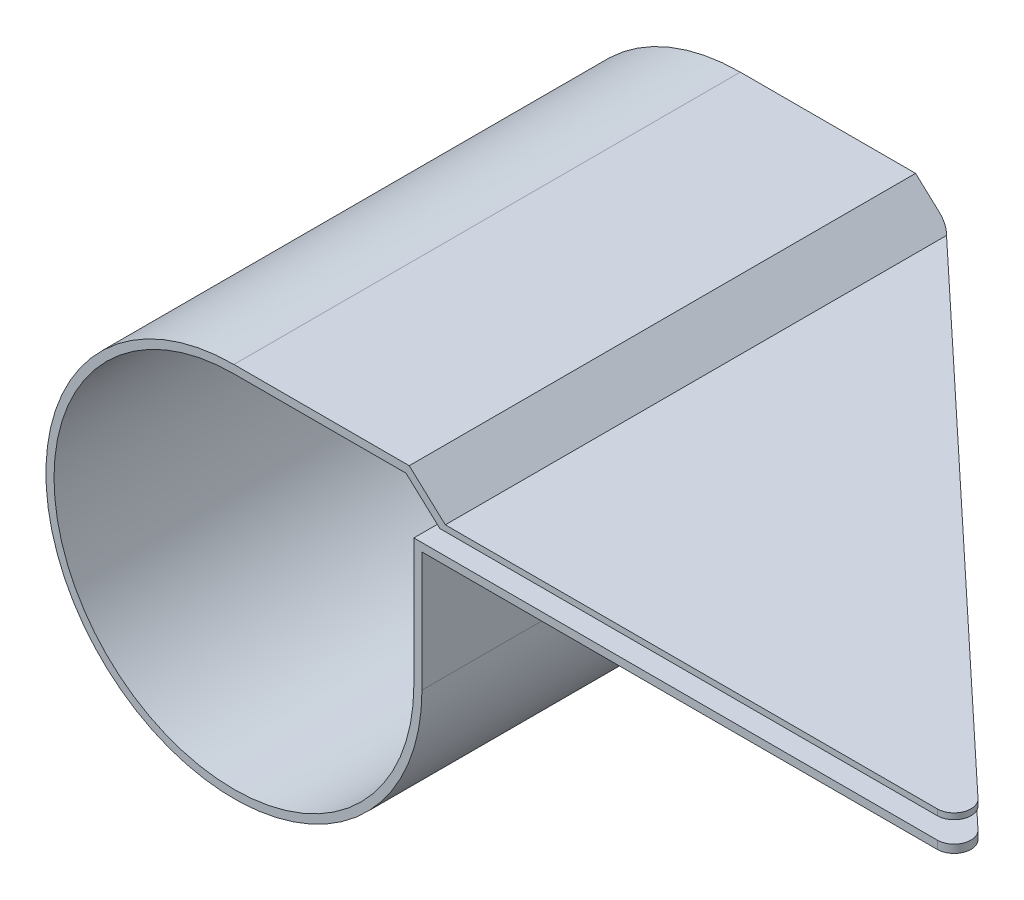
ISO-10303-21;
HEADER;
FILE_DESCRIPTION(('STEP AP214'),'2;1');
FILE_NAME('part.step','',(''),(''),'','','');
FILE_SCHEMA(('AUTOMOTIVE_DESIGN { 1 0 10303 214 1 1 1 1 }'));
ENDSEC;
DATA;
#1=APPLICATION_CONTEXT('core data for automotive mechanical design processes');
#2=APPLICATION_PROTOCOL_DEFINITION('international standard','automotive_design',2000,#1);
#3=PRODUCT_CONTEXT('',#1,'mechanical');
#4=PRODUCT('Part','Part','',(#3));
#5=PRODUCT_RELATED_PRODUCT_CATEGORY('part','',(#4));
#6=PRODUCT_DEFINITION_FORMATION('','',#4);
#7=PRODUCT_DEFINITION_CONTEXT('part definition',#1,'design');
#8=PRODUCT_DEFINITION('design','',#6,#7);
#9=PRODUCT_DEFINITION_SHAPE('','',#8);
#10=(LENGTH_UNIT() NAMED_UNIT(*) SI_UNIT(.MILLI.,.METRE.));
#11=(NAMED_UNIT(*) PLANE_ANGLE_UNIT() SI_UNIT($,.RADIAN.));
#12=(NAMED_UNIT(*) SI_UNIT($,.STERADIAN.) SOLID_ANGLE_UNIT());
#13=UNCERTAINTY_MEASURE_WITH_UNIT(LENGTH_MEASURE(1.E-05),#10,'distance_accuracy_value','');
#14=(GEOMETRIC_REPRESENTATION_CONTEXT(3) GLOBAL_UNCERTAINTY_ASSIGNED_CONTEXT((#13)) GLOBAL_UNIT_ASSIGNED_CONTEXT((#10,
#11,#12)) REPRESENTATION_CONTEXT('',''));
#15=CARTESIAN_POINT('',(0.,0.,0.));
#16=DIRECTION('',(0.,0.,1.));
#17=DIRECTION('',(1.,0.,0.));
#18=AXIS2_PLACEMENT_3D('',#15,#16,#17);
#19=CARTESIAN_POINT('',(0.,23.302810646583,76.2));
#20=DIRECTION('',(0.,1.,0.));
#21=DIRECTION('',(0.,0.,1.));
#22=AXIS2_PLACEMENT_3D('',#19,#20,#21);
#23=PLANE('',#22);
#24=DIRECTION('',(1.,0.,0.));
#25=VECTOR('',#24,1.);
#26=CARTESIAN_POINT('',(0.,23.302810646583,76.2));
#27=LINE('',#26,#25);
#28=CARTESIAN_POINT('',(31.8132242595331,23.302810646583,76.2));
#29=VERTEX_POINT('',#28);
#30=CARTESIAN_POINT('',(105.844896734225,23.302810646583,76.2));
#31=VERTEX_POINT('',#30);
#32=EDGE_CURVE('E293',#29,#31,#27,.T.);
#33=ORIENTED_EDGE('',*,*,#32,.T.);
#34=CARTESIAN_POINT('',(105.844896734225,23.302810646583,73.66));
#35=DIRECTION('',(0.,1.,0.));
#36=DIRECTION('',(0.,0.,1.));
#37=AXIS2_PLACEMENT_3D('',#34,#35,#36);
#38=CIRCLE('',#37,2.54);
#39=CARTESIAN_POINT('',(107.582107201583,23.302810646583,71.8069755014842));
#40=VERTEX_POINT('',#39);
#41=EDGE_CURVE('E11',#31,#40,#38,.T.);
#42=ORIENTED_EDGE('',*,*,#41,.T.);
#43=DIRECTION('',(0.729537204140085,0.,0.68394112888133));
#44=VECTOR('',#43,1.);
#45=CARTESIAN_POINT('',(52.5162162162162,23.302810646583,20.1827027027027));
#46=LINE('',#45,#44);
#47=CARTESIAN_POINT('',(31.8132242595331,23.302810646583,0.773647743312286));
#48=VERTEX_POINT('',#47);
#49=EDGE_CURVE('E177',#48,#40,#46,.T.);
#50=ORIENTED_EDGE('',*,*,#49,.F.);
#51=DIRECTION('',(0.,0.,-1.));
#52=VECTOR('',#51,1.);
#53=CARTESIAN_POINT('',(31.8132242595331,23.302810646583,76.2));
#54=LINE('',#53,#52);
#55=EDGE_CURVE('E188',#29,#48,#54,.T.);
#56=ORIENTED_EDGE('',*,*,#55,.F.);
#57=EDGE_LOOP('',(#33,#42,#50,#56));
#58=FACE_BOUND('',#57,.T.);
#59=ADVANCED_FACE('F45',(#58),#23,.T.);
#60=CARTESIAN_POINT('',(26.1852638031695,28.4777202862093,76.2));
#61=DIRECTION('',(0.676857168252188,0.736114375478179,0.));
#62=DIRECTION('',(-0.736114375478179,0.676857168252188,0.));
#63=AXIS2_PLACEMENT_3D('',#60,#61,#62);
#64=PLANE('',#63);
#65=DIRECTION('',(0.605850736549244,-0.557079752257031,0.567985065514916));
#66=VECTOR('',#65,1.);
#67=CARTESIAN_POINT('',(53.9561600620136,2.94238117620207,21.5326500581378));
#68=LINE('',#67,#66);
#69=CARTESIAN_POINT('',(31.7207738682498,23.387818781368,0.68697550148419));
#70=VERTEX_POINT('',#69);
#71=EDGE_CURVE('E172',#70,#48,#68,.T.);
#72=ORIENTED_EDGE('',*,*,#71,.F.);
#73=CARTESIAN_POINT('',(29.9835634008912,24.9851838061042,2.54));
#74=DIRECTION('',(0.676857168252188,0.736114375478179,0.));
#75=DIRECTION('',(0.736114375478179,-0.676857168252188,0.));
#76=AXIS2_PLACEMENT_3D('',#73,#74,#75);
#77=ELLIPSE('',#76,3.45055073588261,2.54);
#78=CARTESIAN_POINT('',(29.9835634008912,24.9851838061042,0.));
#79=VERTEX_POINT('',#78);
#80=EDGE_CURVE('E227',#70,#79,#77,.T.);
#81=ORIENTED_EDGE('',*,*,#80,.T.);
#82=DIRECTION('',(0.736114375478179,-0.676857168252188,0.));
#83=VECTOR('',#82,1.);
#84=CARTESIAN_POINT('',(26.1852638031695,28.4777202862093,0.));
#85=LINE('',#84,#83);
#86=CARTESIAN_POINT('',(26.383328279743,28.2956,0.));
#87=VERTEX_POINT('',#86);
#88=EDGE_CURVE('E191',#87,#79,#85,.T.);
#89=ORIENTED_EDGE('',*,*,#88,.F.);
#90=DIRECTION('',(0.,0.,-1.));
#91=VECTOR('',#90,1.);
#92=CARTESIAN_POINT('',(26.383328279743,28.2956,76.2));
#93=LINE('',#92,#91);
#94=CARTESIAN_POINT('',(26.383328279743,28.2956,76.2));
#95=VERTEX_POINT('',#94);
#96=EDGE_CURVE('E199',#95,#87,#93,.T.);
#97=ORIENTED_EDGE('',*,*,#96,.F.);
#98=DIRECTION('',(0.736114375478179,-0.676857168252188,0.));
#99=VECTOR('',#98,1.);
#100=CARTESIAN_POINT('',(26.1852638031695,28.4777202862093,76.2));
#101=LINE('',#100,#99);
#102=EDGE_CURVE('E196',#95,#29,#101,.T.);
#103=ORIENTED_EDGE('',*,*,#102,.T.);
#104=ORIENTED_EDGE('',*,*,#55,.T.);
#105=EDGE_LOOP('',(#72,#81,#89,#97,#103,#104));
#106=FACE_BOUND('',#105,.T.);
#107=ADVANCED_FACE('F194',(#106),#64,.T.);
#108=CARTESIAN_POINT('',(0.,28.2956,76.2));
#109=DIRECTION('',(0.,1.,0.));
#110=DIRECTION('',(0.,0.,1.));
#111=AXIS2_PLACEMENT_3D('',#108,#109,#110);
#112=PLANE('',#111);
#113=DIRECTION('',(1.,0.,0.));
#114=VECTOR('',#113,1.);
#115=CARTESIAN_POINT('',(0.,28.2956,0.));
#116=LINE('',#115,#114);
#117=CARTESIAN_POINT('',(0.,28.2956,0.));
#118=VERTEX_POINT('',#117);
#119=EDGE_CURVE('E335',#118,#87,#116,.T.);
#120=ORIENTED_EDGE('',*,*,#119,.F.);
#121=DIRECTION('',(0.,0.,-1.));
#122=VECTOR('',#121,1.);
#123=CARTESIAN_POINT('',(0.,28.2956,76.2));
#124=LINE('',#123,#122);
#125=CARTESIAN_POINT('',(0.,28.2956,76.2));
#126=VERTEX_POINT('',#125);
#127=EDGE_CURVE('E206',#126,#118,#124,.T.);
#128=ORIENTED_EDGE('',*,*,#127,.F.);
#129=DIRECTION('',(1.,0.,0.));
#130=VECTOR('',#129,1.);
#131=CARTESIAN_POINT('',(0.,28.2956,76.2));
#132=LINE('',#131,#130);
#133=EDGE_CURVE('E299',#126,#95,#132,.T.);
#134=ORIENTED_EDGE('',*,*,#133,.T.);
#135=ORIENTED_EDGE('',*,*,#96,.T.);
#136=EDGE_LOOP('',(#120,#128,#134,#135));
#137=FACE_BOUND('',#136,.T.);
#138=ADVANCED_FACE('F390',(#137),#112,.T.);
#139=CARTESIAN_POINT('',(0.,0.,76.2));
#140=DIRECTION('',(0.,0.,-1.));
#141=DIRECTION('',(-1.,0.,0.));
#142=AXIS2_PLACEMENT_3D('',#139,#140,#141);
#143=CYLINDRICAL_SURFACE('',#142,28.2956);
#144=CARTESIAN_POINT('',(0.,0.,0.));
#145=DIRECTION('',(0.,0.,1.));
#146=DIRECTION('',(1.,0.,0.));
#147=AXIS2_PLACEMENT_3D('',#144,#145,#146);
#148=CIRCLE('',#147,28.2956);
#149=CARTESIAN_POINT('',(28.2956,0.,0.));
#150=VERTEX_POINT('',#149);
#151=EDGE_CURVE('E339',#118,#150,#148,.T.);
#152=ORIENTED_EDGE('',*,*,#151,.T.);
#153=DIRECTION('',(0.,0.,-1.));
#154=VECTOR('',#153,1.);
#155=CARTESIAN_POINT('',(28.2956,0.,76.2));
#156=LINE('',#155,#154);
#157=CARTESIAN_POINT('',(28.2956,0.,76.2));
#158=VERTEX_POINT('',#157);
#159=EDGE_CURVE('E377',#158,#150,#156,.T.);
#160=ORIENTED_EDGE('',*,*,#159,.F.);
#161=CARTESIAN_POINT('',(0.,0.,76.2));
#162=DIRECTION('',(0.,0.,1.));
#163=DIRECTION('',(1.,0.,0.));
#164=AXIS2_PLACEMENT_3D('',#161,#162,#163);
#165=CIRCLE('',#164,28.2956);
#166=EDGE_CURVE('E303',#126,#158,#165,.T.);
#167=ORIENTED_EDGE('',*,*,#166,.F.);
#168=ORIENTED_EDGE('',*,*,#127,.T.);
#169=EDGE_LOOP('',(#152,#160,#167,#168));
#170=FACE_BOUND('',#169,.T.);
#171=ADVANCED_FACE('F384',(#170),#143,.T.);
#172=CARTESIAN_POINT('',(28.2956,0.,76.2));
#173=DIRECTION('',(-1.,0.,0.));
#174=DIRECTION('',(0.,0.,1.));
#175=AXIS2_PLACEMENT_3D('',#172,#173,#174);
#176=PLANE('',#175);
#177=DIRECTION('',(0.,1.,0.));
#178=VECTOR('',#177,1.);
#179=CARTESIAN_POINT('',(28.2956,0.,0.));
#180=LINE('',#179,#178);
#181=CARTESIAN_POINT('',(28.2956,18.01114,0.));
#182=VERTEX_POINT('',#181);
#183=EDGE_CURVE('E342',#150,#182,#180,.T.);
#184=ORIENTED_EDGE('',*,*,#183,.T.);
#185=DIRECTION('',(0.,0.,-1.));
#186=VECTOR('',#185,1.);
#187=CARTESIAN_POINT('',(28.2956,18.01114,76.2));
#188=LINE('',#187,#186);
#189=CARTESIAN_POINT('',(28.2956,18.01114,76.2));
#190=VERTEX_POINT('',#189);
#191=EDGE_CURVE('E374',#190,#182,#188,.T.);
#192=ORIENTED_EDGE('',*,*,#191,.F.);
#193=DIRECTION('',(0.,1.,0.));
#194=VECTOR('',#193,1.);
#195=CARTESIAN_POINT('',(28.2956,0.,76.2));
#196=LINE('',#195,#194);
#197=EDGE_CURVE('E306',#158,#190,#196,.T.);
#198=ORIENTED_EDGE('',*,*,#197,.F.);
#199=ORIENTED_EDGE('',*,*,#159,.T.);
#200=EDGE_LOOP('',(#184,#192,#198,#199));
#201=FACE_BOUND('',#200,.T.);
#202=ADVANCED_FACE('F455',(#201),#176,.F.);
#203=CARTESIAN_POINT('',(0.,18.01114,76.2));
#204=DIRECTION('',(0.,1.,0.));
#205=DIRECTION('',(0.,0.,1.));
#206=AXIS2_PLACEMENT_3D('',#203,#204,#205);
#207=PLANE('',#206);
#208=DIRECTION('',(1.,0.,0.));
#209=VECTOR('',#208,1.);
#210=CARTESIAN_POINT('',(0.,18.01114,0.));
#211=LINE('',#210,#209);
#212=CARTESIAN_POINT('',(29.9835634008912,18.01114,0.));
#213=VERTEX_POINT('',#212);
#214=EDGE_CURVE('E272',#182,#213,#211,.T.);
#215=ORIENTED_EDGE('',*,*,#214,.T.);
#216=CARTESIAN_POINT('',(29.9835634008912,18.01114,2.54));
#217=DIRECTION('',(0.,1.,0.));
#218=DIRECTION('',(0.,0.,1.));
#219=AXIS2_PLACEMENT_3D('',#216,#217,#218);
#220=CIRCLE('',#219,2.54);
#221=CARTESIAN_POINT('',(31.7207738682498,18.01114,0.686975501484185));
#222=VERTEX_POINT('',#221);
#223=EDGE_CURVE('E233',#213,#222,#220,.F.);
#224=ORIENTED_EDGE('',*,*,#223,.T.);
#225=DIRECTION('',(-0.729537204140085,0.,-0.68394112888133));
#226=VECTOR('',#225,1.);
#227=CARTESIAN_POINT('',(14.4954261954262,18.01114,-15.4617879417879));
#228=LINE('',#227,#226);
#229=CARTESIAN_POINT('',(107.582107201583,18.01114,71.8069755014842));
#230=VERTEX_POINT('',#229);
#231=EDGE_CURVE('E279',#230,#222,#228,.T.);
#232=ORIENTED_EDGE('',*,*,#231,.F.);
#233=CARTESIAN_POINT('',(105.844896734225,18.01114,73.66));
#234=DIRECTION('',(0.,1.,0.));
#235=DIRECTION('',(0.,0.,1.));
#236=AXIS2_PLACEMENT_3D('',#233,#234,#235);
#237=CIRCLE('',#236,2.54);
#238=CARTESIAN_POINT('',(105.844896734225,18.01114,76.2));
#239=VERTEX_POINT('',#238);
#240=EDGE_CURVE('E230',#230,#239,#237,.F.);
#241=ORIENTED_EDGE('',*,*,#240,.T.);
#242=DIRECTION('',(1.,0.,0.));
#243=VECTOR('',#242,1.);
#244=CARTESIAN_POINT('',(0.,18.01114,76.2));
#245=LINE('',#244,#243);
#246=EDGE_CURVE('E309',#190,#239,#245,.T.);
#247=ORIENTED_EDGE('',*,*,#246,.F.);
#248=ORIENTED_EDGE('',*,*,#191,.T.);
#249=EDGE_LOOP('',(#215,#224,#232,#241,#247,#248));
#250=FACE_BOUND('',#249,.T.);
#251=ADVANCED_FACE('F278',(#250),#207,.F.);
#252=CARTESIAN_POINT('',(0.,19.23034,76.2));
#253=DIRECTION('',(0.,1.,0.));
#254=DIRECTION('',(0.,0.,1.));
#255=AXIS2_PLACEMENT_3D('',#252,#253,#254);
#256=PLANE('',#255);
#257=DIRECTION('',(0.729537204140085,0.,0.68394112888133));
#258=VECTOR('',#257,1.);
#259=CARTESIAN_POINT('',(52.5162162162162,19.23034,20.1827027027027));
#260=LINE('',#259,#258);
#261=CARTESIAN_POINT('',(31.7207738682498,19.23034,0.686975501484183));
#262=VERTEX_POINT('',#261);
#263=CARTESIAN_POINT('',(107.582107201583,19.23034,71.8069755014842));
#264=VERTEX_POINT('',#263);
#265=EDGE_CURVE('E185',#262,#264,#260,.T.);
#266=ORIENTED_EDGE('',*,*,#265,.F.);
#267=CARTESIAN_POINT('',(29.9835634008912,19.23034,2.54));
#268=DIRECTION('',(0.,1.,0.));
#269=DIRECTION('',(0.,0.,1.));
#270=AXIS2_PLACEMENT_3D('',#267,#268,#269);
#271=CIRCLE('',#270,2.54);
#272=CARTESIAN_POINT('',(29.9835634008912,19.23034,0.));
#273=VERTEX_POINT('',#272);
#274=EDGE_CURVE('E246',#262,#273,#271,.T.);
#275=ORIENTED_EDGE('',*,*,#274,.T.);
#276=DIRECTION('',(1.,0.,0.));
#277=VECTOR('',#276,1.);
#278=CARTESIAN_POINT('',(0.,19.23034,0.));
#279=LINE('',#278,#277);
#280=CARTESIAN_POINT('',(27.0764,19.23034,0.));
#281=VERTEX_POINT('',#280);
#282=EDGE_CURVE('E257',#281,#273,#279,.T.);
#283=ORIENTED_EDGE('',*,*,#282,.F.);
#284=DIRECTION('',(0.,0.,-1.));
#285=VECTOR('',#284,1.);
#286=CARTESIAN_POINT('',(27.0764,19.23034,76.2));
#287=LINE('',#286,#285);
#288=CARTESIAN_POINT('',(27.0764,19.23034,76.2));
#289=VERTEX_POINT('',#288);
#290=EDGE_CURVE('E371',#289,#281,#287,.T.);
#291=ORIENTED_EDGE('',*,*,#290,.F.);
#292=DIRECTION('',(1.,0.,0.));
#293=VECTOR('',#292,1.);
#294=CARTESIAN_POINT('',(0.,19.23034,76.2));
#295=LINE('',#294,#293);
#296=CARTESIAN_POINT('',(105.844896734225,19.23034,76.2));
#297=VERTEX_POINT('',#296);
#298=EDGE_CURVE('E312',#289,#297,#295,.T.);
#299=ORIENTED_EDGE('',*,*,#298,.T.);
#300=CARTESIAN_POINT('',(105.844896734225,19.23034,73.66));
#301=DIRECTION('',(0.,1.,0.));
#302=DIRECTION('',(0.,0.,1.));
#303=AXIS2_PLACEMENT_3D('',#300,#301,#302);
#304=CIRCLE('',#303,2.54);
#305=EDGE_CURVE('E243',#297,#264,#304,.T.);
#306=ORIENTED_EDGE('',*,*,#305,.T.);
#307=EDGE_LOOP('',(#266,#275,#283,#291,#299,#306));
#308=FACE_BOUND('',#307,.T.);
#309=ADVANCED_FACE('F256',(#308),#256,.T.);
#310=CARTESIAN_POINT('',(27.0764,0.,76.2));
#311=DIRECTION('',(-1.,0.,0.));
#312=DIRECTION('',(0.,0.,1.));
#313=AXIS2_PLACEMENT_3D('',#310,#311,#312);
#314=PLANE('',#313);
#315=DIRECTION('',(0.,1.,0.));
#316=VECTOR('',#315,1.);
#317=CARTESIAN_POINT('',(27.0764,0.,0.));
#318=LINE('',#317,#316);
#319=CARTESIAN_POINT('',(27.0764,0.,0.));
#320=VERTEX_POINT('',#319);
#321=EDGE_CURVE('E270',#320,#281,#318,.T.);
#322=ORIENTED_EDGE('',*,*,#321,.F.);
#323=DIRECTION('',(0.,0.,-1.));
#324=VECTOR('',#323,1.);
#325=CARTESIAN_POINT('',(27.0764,0.,76.2));
#326=LINE('',#325,#324);
#327=CARTESIAN_POINT('',(27.0764,0.,76.2));
#328=VERTEX_POINT('',#327);
#329=EDGE_CURVE('E368',#328,#320,#326,.T.);
#330=ORIENTED_EDGE('',*,*,#329,.F.);
#331=DIRECTION('',(0.,1.,0.));
#332=VECTOR('',#331,1.);
#333=CARTESIAN_POINT('',(27.0764,0.,76.2));
#334=LINE('',#333,#332);
#335=EDGE_CURVE('E315',#328,#289,#334,.T.);
#336=ORIENTED_EDGE('',*,*,#335,.T.);
#337=ORIENTED_EDGE('',*,*,#290,.T.);
#338=EDGE_LOOP('',(#322,#330,#336,#337));
#339=FACE_BOUND('',#338,.T.);
#340=ADVANCED_FACE('F446',(#339),#314,.T.);
#341=CARTESIAN_POINT('',(0.,0.,76.2));
#342=DIRECTION('',(0.,0.,-1.));
#343=DIRECTION('',(-1.,0.,0.));
#344=AXIS2_PLACEMENT_3D('',#341,#342,#343);
#345=CYLINDRICAL_SURFACE('',#344,27.0764);
#346=CARTESIAN_POINT('',(0.,0.,0.));
#347=DIRECTION('',(0.,0.,1.));
#348=DIRECTION('',(1.,0.,0.));
#349=AXIS2_PLACEMENT_3D('',#346,#347,#348);
#350=CIRCLE('',#349,27.0764);
#351=CARTESIAN_POINT('',(0.,27.0764,0.));
#352=VERTEX_POINT('',#351);
#353=EDGE_CURVE('E349',#352,#320,#350,.T.);
#354=ORIENTED_EDGE('',*,*,#353,.F.);
#355=DIRECTION('',(0.,0.,-1.));
#356=VECTOR('',#355,1.);
#357=CARTESIAN_POINT('',(0.,27.0764,76.2));
#358=LINE('',#357,#356);
#359=CARTESIAN_POINT('',(0.,27.0764,76.2));
#360=VERTEX_POINT('',#359);
#361=EDGE_CURVE('E365',#360,#352,#358,.T.);
#362=ORIENTED_EDGE('',*,*,#361,.F.);
#363=CARTESIAN_POINT('',(0.,0.,76.2));
#364=DIRECTION('',(0.,0.,1.));
#365=DIRECTION('',(1.,0.,0.));
#366=AXIS2_PLACEMENT_3D('',#363,#364,#365);
#367=CIRCLE('',#366,27.0764);
#368=EDGE_CURVE('E319',#360,#328,#367,.T.);
#369=ORIENTED_EDGE('',*,*,#368,.T.);
#370=ORIENTED_EDGE('',*,*,#329,.T.);
#371=EDGE_LOOP('',(#354,#362,#369,#370));
#372=FACE_BOUND('',#371,.T.);
#373=ADVANCED_FACE('F442',(#372),#345,.F.);
#374=CARTESIAN_POINT('',(0.,27.0764,76.2));
#375=DIRECTION('',(0.,1.,0.));
#376=DIRECTION('',(0.,0.,1.));
#377=AXIS2_PLACEMENT_3D('',#374,#375,#376);
#378=PLANE('',#377);
#379=DIRECTION('',(1.,0.,0.));
#380=VECTOR('',#379,1.);
#381=CARTESIAN_POINT('',(0.,27.0764,0.));
#382=LINE('',#381,#380);
#383=CARTESIAN_POINT('',(25.908,27.0764,0.));
#384=VERTEX_POINT('',#383);
#385=EDGE_CURVE('E352',#352,#384,#382,.T.);
#386=ORIENTED_EDGE('',*,*,#385,.T.);
#387=DIRECTION('',(0.,0.,-1.));
#388=VECTOR('',#387,1.);
#389=CARTESIAN_POINT('',(25.908,27.0764,76.2));
#390=LINE('',#389,#388);
#391=CARTESIAN_POINT('',(25.908,27.0764,76.2));
#392=VERTEX_POINT('',#391);
#393=EDGE_CURVE('E361',#392,#384,#390,.T.);
#394=ORIENTED_EDGE('',*,*,#393,.F.);
#395=DIRECTION('',(1.,0.,0.));
#396=VECTOR('',#395,1.);
#397=CARTESIAN_POINT('',(0.,27.0764,76.2));
#398=LINE('',#397,#396);
#399=EDGE_CURVE('E323',#360,#392,#398,.T.);
#400=ORIENTED_EDGE('',*,*,#399,.F.);
#401=ORIENTED_EDGE('',*,*,#361,.T.);
#402=EDGE_LOOP('',(#386,#394,#400,#401));
#403=FACE_BOUND('',#402,.T.);
#404=ADVANCED_FACE('F439',(#403),#378,.F.);
#405=CARTESIAN_POINT('',(25.3600395436364,27.5802496396263,76.2));
#406=DIRECTION('',(0.676857168252187,0.736114375478179,0.));
#407=DIRECTION('',(-0.736114375478179,0.676857168252187,0.));
#408=AXIS2_PLACEMENT_3D('',#405,#406,#407);
#409=PLANE('',#408);
#410=DIRECTION('',(0.736114375478179,-0.676857168252187,0.));
#411=VECTOR('',#410,1.);
#412=CARTESIAN_POINT('',(25.3600395436364,27.5802496396263,0.));
#413=LINE('',#412,#411);
#414=CARTESIAN_POINT('',(29.9835634008912,23.3289194528806,0.));
#415=VERTEX_POINT('',#414);
#416=EDGE_CURVE('E296',#384,#415,#413,.T.);
#417=ORIENTED_EDGE('',*,*,#416,.T.);
#418=CARTESIAN_POINT('',(29.9835634008912,23.3289194528805,2.54));
#419=DIRECTION('',(0.676857168252187,0.736114375478179,0.));
#420=DIRECTION('',(0.736114375478179,-0.676857168252187,0.));
#421=AXIS2_PLACEMENT_3D('',#418,#419,#420);
#422=ELLIPSE('',#421,3.45055073588261,2.54);
#423=CARTESIAN_POINT('',(30.988,22.40534,0.207038980529092));
#424=VERTEX_POINT('',#423);
#425=EDGE_CURVE('E213',#415,#424,#422,.F.);
#426=ORIENTED_EDGE('',*,*,#425,.T.);
#427=DIRECTION('',(0.,0.,-1.));
#428=VECTOR('',#427,1.);
#429=CARTESIAN_POINT('',(30.988,22.40534,76.2));
#430=LINE('',#429,#428);
#431=CARTESIAN_POINT('',(30.988,22.40534,76.2));
#432=VERTEX_POINT('',#431);
#433=EDGE_CURVE('E332',#432,#424,#430,.T.);
#434=ORIENTED_EDGE('',*,*,#433,.F.);
#435=DIRECTION('',(0.736114375478179,-0.676857168252187,0.));
#436=VECTOR('',#435,1.);
#437=CARTESIAN_POINT('',(25.3600395436364,27.5802496396263,76.2));
#438=LINE('',#437,#436);
#439=EDGE_CURVE('E326',#392,#432,#438,.T.);
#440=ORIENTED_EDGE('',*,*,#439,.F.);
#441=ORIENTED_EDGE('',*,*,#393,.T.);
#442=EDGE_LOOP('',(#417,#426,#434,#440,#441));
#443=FACE_BOUND('',#442,.T.);
#444=ADVANCED_FACE('F399',(#443),#409,.F.);
#445=CARTESIAN_POINT('',(0.,22.40534,76.2));
#446=DIRECTION('',(0.,1.,0.));
#447=DIRECTION('',(0.,0.,1.));
#448=AXIS2_PLACEMENT_3D('',#445,#446,#447);
#449=PLANE('',#448);
#450=ORIENTED_EDGE('',*,*,#433,.T.);
#451=CARTESIAN_POINT('',(29.9835634008912,22.40534,2.54));
#452=DIRECTION('',(0.,1.,0.));
#453=DIRECTION('',(0.,0.,1.));
#454=AXIS2_PLACEMENT_3D('',#451,#452,#453);
#455=CIRCLE('',#454,2.54);
#456=CARTESIAN_POINT('',(31.7207738682498,22.40534,0.686975501484183));
#457=VERTEX_POINT('',#456);
#458=EDGE_CURVE('E219',#424,#457,#455,.F.);
#459=ORIENTED_EDGE('',*,*,#458,.T.);
#460=DIRECTION('',(0.729537204140085,0.,0.68394112888133));
#461=VECTOR('',#460,1.);
#462=CARTESIAN_POINT('',(52.5162162162162,22.40534,20.1827027027027));
#463=LINE('',#462,#461);
#464=CARTESIAN_POINT('',(107.582107201583,22.40534,71.8069755014842));
#465=VERTEX_POINT('',#464);
#466=EDGE_CURVE('E285',#457,#465,#463,.T.);
#467=ORIENTED_EDGE('',*,*,#466,.T.);
#468=CARTESIAN_POINT('',(105.844896734225,22.40534,73.66));
#469=DIRECTION('',(0.,1.,0.));
#470=DIRECTION('',(0.,0.,1.));
#471=AXIS2_PLACEMENT_3D('',#468,#469,#470);
#472=CIRCLE('',#471,2.54);
#473=CARTESIAN_POINT('',(105.844896734225,22.40534,76.2));
#474=VERTEX_POINT('',#473);
#475=EDGE_CURVE('E216',#465,#474,#472,.F.);
#476=ORIENTED_EDGE('',*,*,#475,.T.);
#477=DIRECTION('',(1.,0.,0.));
#478=VECTOR('',#477,1.);
#479=CARTESIAN_POINT('',(0.,22.40534,76.2));
#480=LINE('',#479,#478);
#481=EDGE_CURVE('E329',#432,#474,#480,.T.);
#482=ORIENTED_EDGE('',*,*,#481,.F.);
#483=EDGE_LOOP('',(#450,#459,#467,#476,#482));
#484=FACE_BOUND('',#483,.T.);
#485=ADVANCED_FACE('F403',(#484),#449,.F.);
#486=CARTESIAN_POINT('',(0.,0.,76.2));
#487=DIRECTION('',(0.,0.,1.));
#488=DIRECTION('',(1.,0.,0.));
#489=AXIS2_PLACEMENT_3D('',#486,#487,#488);
#490=PLANE('',#489);
#491=ORIENTED_EDGE('',*,*,#481,.T.);
#492=DIRECTION('',(0.,-1.,0.));
#493=VECTOR('',#492,1.);
#494=CARTESIAN_POINT('',(105.844896734225,23.302810646583,76.2));
#495=LINE('',#494,#493);
#496=EDGE_CURVE('E54',#474,#31,#495,.F.);
#497=ORIENTED_EDGE('',*,*,#496,.T.);
#498=ORIENTED_EDGE('',*,*,#32,.F.);
#499=ORIENTED_EDGE('',*,*,#102,.F.);
#500=ORIENTED_EDGE('',*,*,#133,.F.);
#501=ORIENTED_EDGE('',*,*,#166,.T.);
#502=ORIENTED_EDGE('',*,*,#197,.T.);
#503=ORIENTED_EDGE('',*,*,#246,.T.);
#504=DIRECTION('',(0.,-1.,0.));
#505=VECTOR('',#504,1.);
#506=CARTESIAN_POINT('',(105.844896734225,19.23034,76.2));
#507=LINE('',#506,#505);
#508=EDGE_CURVE('E67',#239,#297,#507,.F.);
#509=ORIENTED_EDGE('',*,*,#508,.T.);
#510=ORIENTED_EDGE('',*,*,#298,.F.);
#511=ORIENTED_EDGE('',*,*,#335,.F.);
#512=ORIENTED_EDGE('',*,*,#368,.F.);
#513=ORIENTED_EDGE('',*,*,#399,.T.);
#514=ORIENTED_EDGE('',*,*,#439,.T.);
#515=EDGE_LOOP('',(#491,#497,#498,#499,#500,#501,#502,#503,#509,#510,#511,#512,#513,#514));
#516=FACE_BOUND('',#515,.T.);
#517=ADVANCED_FACE('F404',(#516),#490,.T.);
#518=CARTESIAN_POINT('',(0.,0.,0.));
#519=DIRECTION('',(0.,0.,1.));
#520=DIRECTION('',(1.,0.,0.));
#521=AXIS2_PLACEMENT_3D('',#518,#519,#520);
#522=PLANE('',#521);
#523=ORIENTED_EDGE('',*,*,#88,.T.);
#524=DIRECTION('',(0.,-1.,0.));
#525=VECTOR('',#524,1.);
#526=CARTESIAN_POINT('',(29.9835634008912,0.,0.));
#527=LINE('',#526,#525);
#528=EDGE_CURVE('E204',#79,#415,#527,.T.);
#529=ORIENTED_EDGE('',*,*,#528,.T.);
#530=ORIENTED_EDGE('',*,*,#416,.F.);
#531=ORIENTED_EDGE('',*,*,#385,.F.);
#532=ORIENTED_EDGE('',*,*,#353,.T.);
#533=ORIENTED_EDGE('',*,*,#321,.T.);
#534=ORIENTED_EDGE('',*,*,#282,.T.);
#535=DIRECTION('',(0.,-1.,0.));
#536=VECTOR('',#535,1.);
#537=CARTESIAN_POINT('',(29.9835634008912,0.,0.));
#538=LINE('',#537,#536);
#539=EDGE_CURVE('E198',#273,#213,#538,.T.);
#540=ORIENTED_EDGE('',*,*,#539,.T.);
#541=ORIENTED_EDGE('',*,*,#214,.F.);
#542=ORIENTED_EDGE('',*,*,#183,.F.);
#543=ORIENTED_EDGE('',*,*,#151,.F.);
#544=ORIENTED_EDGE('',*,*,#119,.T.);
#545=EDGE_LOOP('',(#523,#529,#530,#531,#532,#533,#534,#540,#541,#542,#543,#544));
#546=FACE_BOUND('',#545,.T.);
#547=ADVANCED_FACE('F265',(#546),#522,.F.);
#548=CARTESIAN_POINT('',(14.4954261954262,28.2956,-15.4617879417879));
#549=DIRECTION('',(-0.68394112888133,0.,0.729537204140085));
#550=DIRECTION('',(0.729537204140085,0.,0.68394112888133));
#551=AXIS2_PLACEMENT_3D('',#548,#549,#550);
#552=PLANE('',#551);
#553=ORIENTED_EDGE('',*,*,#231,.T.);
#554=DIRECTION('',(0.,-1.,0.));
#555=VECTOR('',#554,1.);
#556=CARTESIAN_POINT('',(31.7207738682498,28.2956,0.686975501484182));
#557=LINE('',#556,#555);
#558=EDGE_CURVE('E240',#222,#262,#557,.F.);
#559=ORIENTED_EDGE('',*,*,#558,.T.);
#560=ORIENTED_EDGE('',*,*,#265,.T.);
#561=DIRECTION('',(0.,-1.,0.));
#562=VECTOR('',#561,1.);
#563=CARTESIAN_POINT('',(107.582107201583,18.01114,71.8069755014842));
#564=LINE('',#563,#562);
#565=EDGE_CURVE('E236',#264,#230,#564,.T.);
#566=ORIENTED_EDGE('',*,*,#565,.T.);
#567=EDGE_LOOP('',(#553,#559,#560,#566));
#568=FACE_BOUND('',#567,.T.);
#569=ADVANCED_FACE('F282',(#568),#552,.F.);
#570=ORIENTED_EDGE('',*,*,#466,.F.);
#571=DIRECTION('',(0.,-1.,0.));
#572=VECTOR('',#571,1.);
#573=CARTESIAN_POINT('',(31.7207738682498,28.2956,0.686975501484182));
#574=LINE('',#573,#572);
#575=EDGE_CURVE('E180',#457,#70,#574,.F.);
#576=ORIENTED_EDGE('',*,*,#575,.T.);
#577=ORIENTED_EDGE('',*,*,#71,.T.);
#578=ORIENTED_EDGE('',*,*,#49,.T.);
#579=DIRECTION('',(0.,-1.,0.));
#580=VECTOR('',#579,1.);
#581=CARTESIAN_POINT('',(107.582107201583,22.40534,71.8069755014842));
#582=LINE('',#581,#580);
#583=EDGE_CURVE('E222',#40,#465,#582,.T.);
#584=ORIENTED_EDGE('',*,*,#583,.T.);
#585=EDGE_LOOP('',(#570,#576,#577,#578,#584));
#586=FACE_BOUND('',#585,.T.);
#587=ADVANCED_FACE('F175',(#586),#552,.F.);
#588=CARTESIAN_POINT('',(29.9835634008912,0.,2.54));
#589=DIRECTION('',(0.,-1.,0.));
#590=DIRECTION('',(0.,0.,-1.));
#591=AXIS2_PLACEMENT_3D('',#588,#589,#590);
#592=CYLINDRICAL_SURFACE('',#591,2.54);
#593=ORIENTED_EDGE('',*,*,#80,.F.);
#594=ORIENTED_EDGE('',*,*,#575,.F.);
#595=ORIENTED_EDGE('',*,*,#458,.F.);
#596=ORIENTED_EDGE('',*,*,#425,.F.);
#597=ORIENTED_EDGE('',*,*,#528,.F.);
#598=EDGE_LOOP('',(#593,#594,#595,#596,#597));
#599=FACE_BOUND('',#598,.T.);
#600=ADVANCED_FACE('F395',(#599),#592,.T.);
#601=CARTESIAN_POINT('',(29.9835634008912,0.,2.54));
#602=DIRECTION('',(0.,-1.,0.));
#603=DIRECTION('',(0.,0.,-1.));
#604=AXIS2_PLACEMENT_3D('',#601,#602,#603);
#605=CYLINDRICAL_SURFACE('',#604,2.54);
#606=ORIENTED_EDGE('',*,*,#274,.F.);
#607=ORIENTED_EDGE('',*,*,#558,.F.);
#608=ORIENTED_EDGE('',*,*,#223,.F.);
#609=ORIENTED_EDGE('',*,*,#539,.F.);
#610=EDGE_LOOP('',(#606,#607,#608,#609));
#611=FACE_BOUND('',#610,.T.);
#612=ADVANCED_FACE('F274',(#611),#605,.T.);
#613=CARTESIAN_POINT('',(105.844896734225,28.2956,73.66));
#614=DIRECTION('',(0.,1.,0.));
#615=DIRECTION('',(0.,0.,1.));
#616=AXIS2_PLACEMENT_3D('',#613,#614,#615);
#617=CYLINDRICAL_SURFACE('',#616,2.54);
#618=ORIENTED_EDGE('',*,*,#41,.F.);
#619=ORIENTED_EDGE('',*,*,#496,.F.);
#620=ORIENTED_EDGE('',*,*,#475,.F.);
#621=ORIENTED_EDGE('',*,*,#583,.F.);
#622=EDGE_LOOP('',(#618,#619,#620,#621));
#623=FACE_BOUND('',#622,.T.);
#624=ADVANCED_FACE('F406',(#623),#617,.T.);
#625=CARTESIAN_POINT('',(105.844896734225,28.2956,73.66));
#626=DIRECTION('',(0.,1.,0.));
#627=DIRECTION('',(0.,0.,1.));
#628=AXIS2_PLACEMENT_3D('',#625,#626,#627);
#629=CYLINDRICAL_SURFACE('',#628,2.54);
#630=ORIENTED_EDGE('',*,*,#305,.F.);
#631=ORIENTED_EDGE('',*,*,#508,.F.);
#632=ORIENTED_EDGE('',*,*,#240,.F.);
#633=ORIENTED_EDGE('',*,*,#565,.F.);
#634=EDGE_LOOP('',(#630,#631,#632,#633));
#635=FACE_BOUND('',#634,.T.);
#636=ADVANCED_FACE('F47',(#635),#629,.T.);
#637=CLOSED_SHELL('',(#59,#107,#138,#171,#202,#251,#309,#340,#373,#404,#444,#485,#517,#547,#569,
#587,#600,#612,#624,#636));
#638=MANIFOLD_SOLID_BREP('B2',#637);
#639=ADVANCED_BREP_SHAPE_REPRESENTATION('',(#18,#638),#14);
#640=SHAPE_DEFINITION_REPRESENTATION(#9,#639);
ENDSEC;
END-ISO-10303-21;
